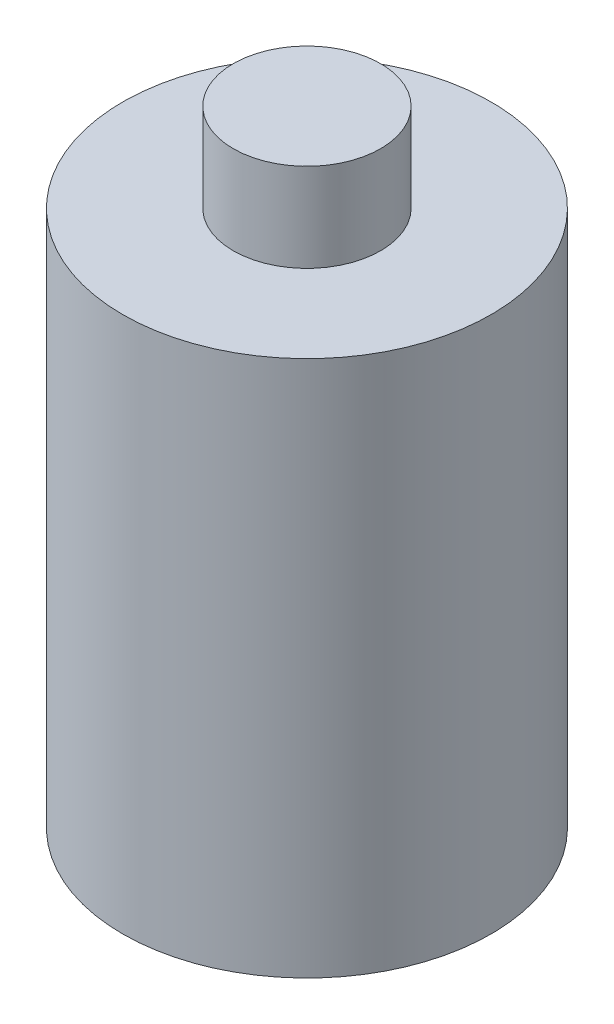
ISO-10303-21;
HEADER;
FILE_DESCRIPTION(('STEP AP214'),'2;1');
FILE_NAME('part.step','',(''),(''),'','','');
FILE_SCHEMA(('AUTOMOTIVE_DESIGN { 1 0 10303 214 1 1 1 1 }'));
ENDSEC;
DATA;
#1=APPLICATION_CONTEXT('core data for automotive mechanical design processes');
#2=APPLICATION_PROTOCOL_DEFINITION('international standard','automotive_design',2000,#1);
#3=PRODUCT_CONTEXT('',#1,'mechanical');
#4=PRODUCT('Part','Part','',(#3));
#5=PRODUCT_RELATED_PRODUCT_CATEGORY('part','',(#4));
#6=PRODUCT_DEFINITION_FORMATION('','',#4);
#7=PRODUCT_DEFINITION_CONTEXT('part definition',#1,'design');
#8=PRODUCT_DEFINITION('design','',#6,#7);
#9=PRODUCT_DEFINITION_SHAPE('','',#8);
#10=(LENGTH_UNIT() NAMED_UNIT(*) SI_UNIT(.MILLI.,.METRE.));
#11=(NAMED_UNIT(*) PLANE_ANGLE_UNIT() SI_UNIT($,.RADIAN.));
#12=(NAMED_UNIT(*) SI_UNIT($,.STERADIAN.) SOLID_ANGLE_UNIT());
#13=UNCERTAINTY_MEASURE_WITH_UNIT(LENGTH_MEASURE(1.E-05),#10,'distance_accuracy_value','');
#14=(GEOMETRIC_REPRESENTATION_CONTEXT(3) GLOBAL_UNCERTAINTY_ASSIGNED_CONTEXT((#13)) GLOBAL_UNIT_ASSIGNED_CONTEXT((#10,
#11,#12)) REPRESENTATION_CONTEXT('',''));
#15=CARTESIAN_POINT('',(0.,0.,0.));
#16=DIRECTION('',(0.,0.,1.));
#17=DIRECTION('',(1.,0.,0.));
#18=AXIS2_PLACEMENT_3D('',#15,#16,#17);
#19=CARTESIAN_POINT('',(0.,18.2,0.));
#20=DIRECTION('',(0.,-1.,0.));
#21=DIRECTION('',(0.,0.,-1.));
#22=AXIS2_PLACEMENT_3D('',#19,#20,#21);
#23=CYLINDRICAL_SURFACE('',#22,6.25);
#24=CARTESIAN_POINT('',(0.,18.2,0.));
#25=DIRECTION('',(0.,1.,0.));
#26=DIRECTION('',(0.,0.,1.));
#27=AXIS2_PLACEMENT_3D('',#24,#25,#26);
#28=CIRCLE('',#27,6.25);
#29=CARTESIAN_POINT('',(0.,18.2,6.25));
#30=VERTEX_POINT('',#29);
#31=EDGE_CURVE('E44',#30,#30,#28,.T.);
#32=ORIENTED_EDGE('',*,*,#31,.F.);
#33=EDGE_LOOP('',(#32));
#34=FACE_BOUND('',#33,.T.);
#35=CARTESIAN_POINT('',(0.,0.,0.));
#36=DIRECTION('',(0.,1.,0.));
#37=DIRECTION('',(0.,0.,1.));
#38=AXIS2_PLACEMENT_3D('',#35,#36,#37);
#39=CIRCLE('',#38,6.25);
#40=CARTESIAN_POINT('',(0.,0.,6.25));
#41=VERTEX_POINT('',#40);
#42=EDGE_CURVE('E40',#41,#41,#39,.T.);
#43=ORIENTED_EDGE('',*,*,#42,.T.);
#44=EDGE_LOOP('',(#43));
#45=FACE_BOUND('',#44,.T.);
#46=ADVANCED_FACE('F37',(#34,#45),#23,.T.);
#47=CARTESIAN_POINT('',(0.,18.2,0.));
#48=DIRECTION('',(0.,1.,0.));
#49=DIRECTION('',(0.,0.,1.));
#50=AXIS2_PLACEMENT_3D('',#47,#48,#49);
#51=PLANE('',#50);
#52=CARTESIAN_POINT('',(0.,18.2,0.));
#53=DIRECTION('',(0.,1.,0.));
#54=DIRECTION('',(0.,0.,1.));
#55=AXIS2_PLACEMENT_3D('',#52,#53,#54);
#56=CIRCLE('',#55,2.5);
#57=CARTESIAN_POINT('',(0.,18.2,2.5));
#58=VERTEX_POINT('',#57);
#59=EDGE_CURVE('E10',#58,#58,#56,.T.);
#60=ORIENTED_EDGE('',*,*,#59,.F.);
#61=EDGE_LOOP('',(#60));
#62=FACE_BOUND('',#61,.T.);
#63=ORIENTED_EDGE('',*,*,#31,.T.);
#64=EDGE_LOOP('',(#63));
#65=FACE_BOUND('',#64,.T.);
#66=ADVANCED_FACE('F61',(#62,#65),#51,.T.);
#67=CARTESIAN_POINT('',(0.,0.,0.));
#68=DIRECTION('',(0.,1.,0.));
#69=DIRECTION('',(0.,0.,1.));
#70=AXIS2_PLACEMENT_3D('',#67,#68,#69);
#71=PLANE('',#70);
#72=ORIENTED_EDGE('',*,*,#42,.F.);
#73=EDGE_LOOP('',(#72));
#74=FACE_BOUND('',#73,.T.);
#75=ADVANCED_FACE('F58',(#74),#71,.F.);
#76=CARTESIAN_POINT('',(0.,21.2,0.));
#77=DIRECTION('',(0.,-1.,0.));
#78=DIRECTION('',(0.,0.,-1.));
#79=AXIS2_PLACEMENT_3D('',#76,#77,#78);
#80=CYLINDRICAL_SURFACE('',#79,2.5);
#81=CARTESIAN_POINT('',(0.,21.2,0.));
#82=DIRECTION('',(0.,1.,0.));
#83=DIRECTION('',(0.,0.,1.));
#84=AXIS2_PLACEMENT_3D('',#81,#82,#83);
#85=CIRCLE('',#84,2.5);
#86=CARTESIAN_POINT('',(0.,21.2,2.5));
#87=VERTEX_POINT('',#86);
#88=EDGE_CURVE('E50',#87,#87,#85,.T.);
#89=ORIENTED_EDGE('',*,*,#88,.F.);
#90=EDGE_LOOP('',(#89));
#91=FACE_BOUND('',#90,.T.);
#92=ORIENTED_EDGE('',*,*,#59,.T.);
#93=EDGE_LOOP('',(#92));
#94=FACE_BOUND('',#93,.T.);
#95=ADVANCED_FACE('F60',(#91,#94),#80,.T.);
#96=CARTESIAN_POINT('',(0.,21.2,0.));
#97=DIRECTION('',(0.,1.,0.));
#98=DIRECTION('',(0.,0.,1.));
#99=AXIS2_PLACEMENT_3D('',#96,#97,#98);
#100=PLANE('',#99);
#101=ORIENTED_EDGE('',*,*,#88,.T.);
#102=EDGE_LOOP('',(#101));
#103=FACE_BOUND('',#102,.T.);
#104=ADVANCED_FACE('F66',(#103),#100,.T.);
#105=CLOSED_SHELL('',(#46,#66,#75,#95,#104));
#106=MANIFOLD_SOLID_BREP('B2',#105);
#107=ADVANCED_BREP_SHAPE_REPRESENTATION('',(#18,#106),#14);
#108=SHAPE_DEFINITION_REPRESENTATION(#9,#107);
ENDSEC;
END-ISO-10303-21;
